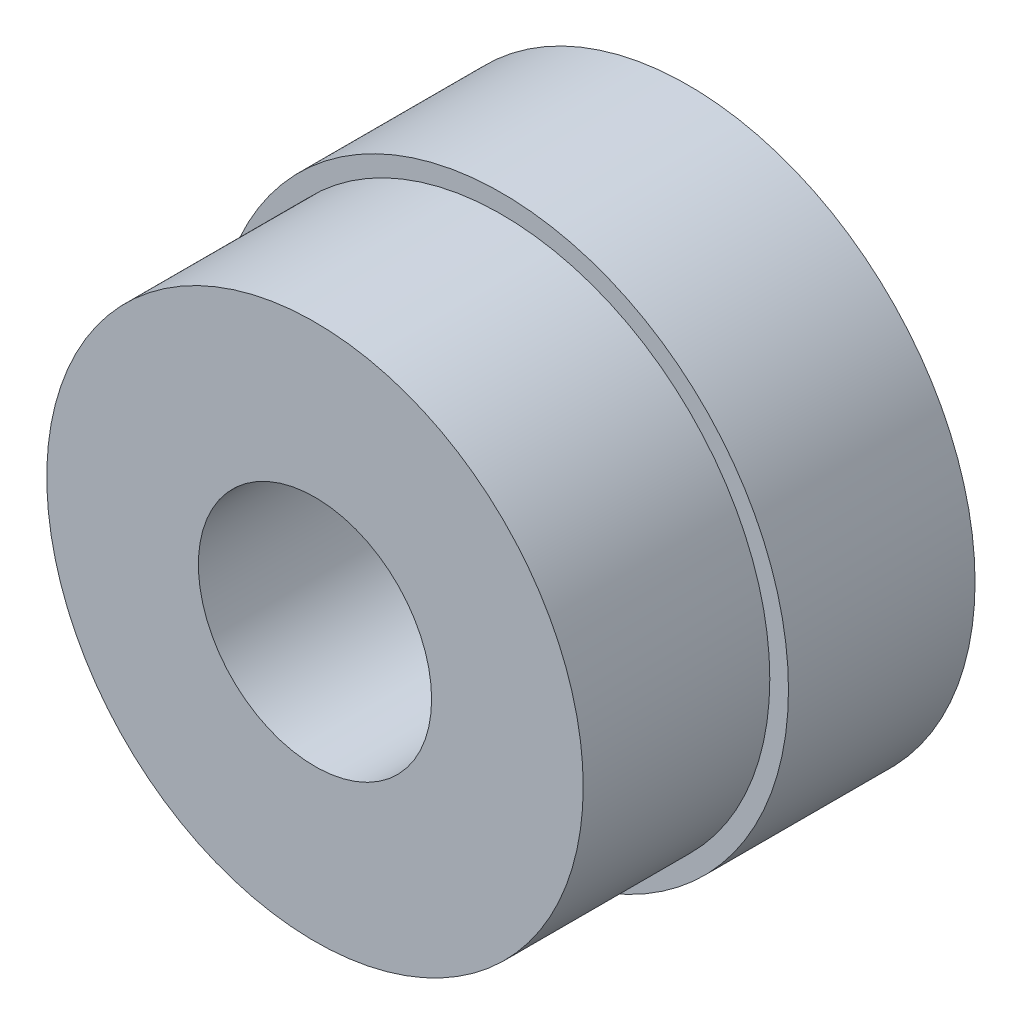
ISO-10303-21;
HEADER;
FILE_DESCRIPTION(('STEP AP214'),'2;1');
FILE_NAME('part.step','',(''),(''),'','','');
FILE_SCHEMA(('AUTOMOTIVE_DESIGN { 1 0 10303 214 1 1 1 1 }'));
ENDSEC;
DATA;
#1=APPLICATION_CONTEXT('core data for automotive mechanical design processes');
#2=APPLICATION_PROTOCOL_DEFINITION('international standard','automotive_design',2000,#1);
#3=PRODUCT_CONTEXT('',#1,'mechanical');
#4=PRODUCT('Part','Part','',(#3));
#5=PRODUCT_RELATED_PRODUCT_CATEGORY('part','',(#4));
#6=PRODUCT_DEFINITION_FORMATION('','',#4);
#7=PRODUCT_DEFINITION_CONTEXT('part definition',#1,'design');
#8=PRODUCT_DEFINITION('design','',#6,#7);
#9=PRODUCT_DEFINITION_SHAPE('','',#8);
#10=(LENGTH_UNIT() NAMED_UNIT(*) SI_UNIT(.MILLI.,.METRE.));
#11=(NAMED_UNIT(*) PLANE_ANGLE_UNIT() SI_UNIT($,.RADIAN.));
#12=(NAMED_UNIT(*) SI_UNIT($,.STERADIAN.) SOLID_ANGLE_UNIT());
#13=UNCERTAINTY_MEASURE_WITH_UNIT(LENGTH_MEASURE(1.E-05),#10,'distance_accuracy_value','');
#14=(GEOMETRIC_REPRESENTATION_CONTEXT(3) GLOBAL_UNCERTAINTY_ASSIGNED_CONTEXT((#13)) GLOBAL_UNIT_ASSIGNED_CONTEXT((#10,
#11,#12)) REPRESENTATION_CONTEXT('',''));
#15=CARTESIAN_POINT('',(0.,0.,0.));
#16=DIRECTION('',(0.,0.,1.));
#17=DIRECTION('',(1.,0.,0.));
#18=AXIS2_PLACEMENT_3D('',#15,#16,#17);
#19=CARTESIAN_POINT('',(0.,0.,4.));
#20=DIRECTION('',(0.,0.,-1.));
#21=DIRECTION('',(-1.,0.,0.));
#22=AXIS2_PLACEMENT_3D('',#19,#20,#21);
#23=CYLINDRICAL_SURFACE('',#22,6.15);
#24=CARTESIAN_POINT('',(0.,0.,4.));
#25=DIRECTION('',(0.,0.,1.));
#26=DIRECTION('',(1.,0.,0.));
#27=AXIS2_PLACEMENT_3D('',#24,#25,#26);
#28=CIRCLE('',#27,6.15);
#29=CARTESIAN_POINT('',(6.15,0.,4.));
#30=VERTEX_POINT('',#29);
#31=EDGE_CURVE('E10',#30,#30,#28,.T.);
#32=ORIENTED_EDGE('',*,*,#31,.F.);
#33=EDGE_LOOP('',(#32));
#34=FACE_BOUND('',#33,.T.);
#35=CARTESIAN_POINT('',(0.,0.,0.));
#36=DIRECTION('',(0.,0.,1.));
#37=DIRECTION('',(1.,0.,0.));
#38=AXIS2_PLACEMENT_3D('',#35,#36,#37);
#39=CIRCLE('',#38,6.15);
#40=CARTESIAN_POINT('',(6.15,0.,0.));
#41=VERTEX_POINT('',#40);
#42=EDGE_CURVE('E34',#41,#41,#39,.T.);
#43=ORIENTED_EDGE('',*,*,#42,.T.);
#44=EDGE_LOOP('',(#43));
#45=FACE_BOUND('',#44,.T.);
#46=ADVANCED_FACE('F31',(#34,#45),#23,.T.);
#47=CARTESIAN_POINT('',(0.,0.,4.));
#48=DIRECTION('',(0.,0.,1.));
#49=DIRECTION('',(1.,0.,0.));
#50=AXIS2_PLACEMENT_3D('',#47,#48,#49);
#51=PLANE('',#50);
#52=CARTESIAN_POINT('',(0.,0.,4.));
#53=DIRECTION('',(0.,0.,1.));
#54=DIRECTION('',(1.,0.,0.));
#55=AXIS2_PLACEMENT_3D('',#52,#53,#54);
#56=CIRCLE('',#55,5.75);
#57=CARTESIAN_POINT('',(5.75,0.,4.));
#58=VERTEX_POINT('',#57);
#59=EDGE_CURVE('E43',#58,#58,#56,.T.);
#60=ORIENTED_EDGE('',*,*,#59,.F.);
#61=EDGE_LOOP('',(#60));
#62=FACE_BOUND('',#61,.T.);
#63=ORIENTED_EDGE('',*,*,#31,.T.);
#64=EDGE_LOOP('',(#63));
#65=FACE_BOUND('',#64,.T.);
#66=ADVANCED_FACE('F76',(#62,#65),#51,.T.);
#67=CARTESIAN_POINT('',(0.,0.,0.));
#68=DIRECTION('',(0.,0.,1.));
#69=DIRECTION('',(1.,0.,0.));
#70=AXIS2_PLACEMENT_3D('',#67,#68,#69);
#71=PLANE('',#70);
#72=CARTESIAN_POINT('',(0.,0.,0.));
#73=DIRECTION('',(0.,0.,1.));
#74=DIRECTION('',(1.,0.,0.));
#75=AXIS2_PLACEMENT_3D('',#72,#73,#74);
#76=CIRCLE('',#75,2.5);
#77=CARTESIAN_POINT('',(2.5,0.,0.));
#78=VERTEX_POINT('',#77);
#79=EDGE_CURVE('E46',#78,#78,#76,.T.);
#80=ORIENTED_EDGE('',*,*,#79,.T.);
#81=EDGE_LOOP('',(#80));
#82=FACE_BOUND('',#81,.T.);
#83=ORIENTED_EDGE('',*,*,#42,.F.);
#84=EDGE_LOOP('',(#83));
#85=FACE_BOUND('',#84,.T.);
#86=ADVANCED_FACE('F55',(#82,#85),#71,.F.);
#87=CARTESIAN_POINT('',(0.,0.,8.));
#88=DIRECTION('',(0.,0.,-1.));
#89=DIRECTION('',(-1.,0.,0.));
#90=AXIS2_PLACEMENT_3D('',#87,#88,#89);
#91=CYLINDRICAL_SURFACE('',#90,5.75);
#92=CARTESIAN_POINT('',(0.,0.,8.));
#93=DIRECTION('',(0.,0.,1.));
#94=DIRECTION('',(1.,0.,0.));
#95=AXIS2_PLACEMENT_3D('',#92,#93,#94);
#96=CIRCLE('',#95,5.75);
#97=CARTESIAN_POINT('',(5.75,0.,8.));
#98=VERTEX_POINT('',#97);
#99=EDGE_CURVE('E41',#98,#98,#96,.T.);
#100=ORIENTED_EDGE('',*,*,#99,.F.);
#101=EDGE_LOOP('',(#100));
#102=FACE_BOUND('',#101,.T.);
#103=ORIENTED_EDGE('',*,*,#59,.T.);
#104=EDGE_LOOP('',(#103));
#105=FACE_BOUND('',#104,.T.);
#106=ADVANCED_FACE('F67',(#102,#105),#91,.T.);
#107=CARTESIAN_POINT('',(0.,0.,8.));
#108=DIRECTION('',(0.,0.,1.));
#109=DIRECTION('',(1.,0.,0.));
#110=AXIS2_PLACEMENT_3D('',#107,#108,#109);
#111=PLANE('',#110);
#112=CARTESIAN_POINT('',(0.,0.,8.));
#113=DIRECTION('',(0.,0.,1.));
#114=DIRECTION('',(1.,0.,0.));
#115=AXIS2_PLACEMENT_3D('',#112,#113,#114);
#116=CIRCLE('',#115,2.5);
#117=CARTESIAN_POINT('',(2.5,0.,8.));
#118=VERTEX_POINT('',#117);
#119=EDGE_CURVE('E49',#118,#118,#116,.T.);
#120=ORIENTED_EDGE('',*,*,#119,.F.);
#121=EDGE_LOOP('',(#120));
#122=FACE_BOUND('',#121,.T.);
#123=ORIENTED_EDGE('',*,*,#99,.T.);
#124=EDGE_LOOP('',(#123));
#125=FACE_BOUND('',#124,.T.);
#126=ADVANCED_FACE('F61',(#122,#125),#111,.T.);
#127=CARTESIAN_POINT('',(0.,0.,0.));
#128=DIRECTION('',(0.,0.,1.));
#129=DIRECTION('',(1.,0.,0.));
#130=AXIS2_PLACEMENT_3D('',#127,#128,#129);
#131=CYLINDRICAL_SURFACE('',#130,2.5);
#132=ORIENTED_EDGE('',*,*,#79,.F.);
#133=EDGE_LOOP('',(#132));
#134=FACE_BOUND('',#133,.T.);
#135=ORIENTED_EDGE('',*,*,#119,.T.);
#136=EDGE_LOOP('',(#135));
#137=FACE_BOUND('',#136,.T.);
#138=ADVANCED_FACE('F58',(#134,#137),#131,.F.);
#139=CLOSED_SHELL('',(#46,#66,#86,#106,#126,#138));
#140=MANIFOLD_SOLID_BREP('B2',#139);
#141=ADVANCED_BREP_SHAPE_REPRESENTATION('',(#18,#140),#14);
#142=SHAPE_DEFINITION_REPRESENTATION(#9,#141);
ENDSEC;
END-ISO-10303-21;
